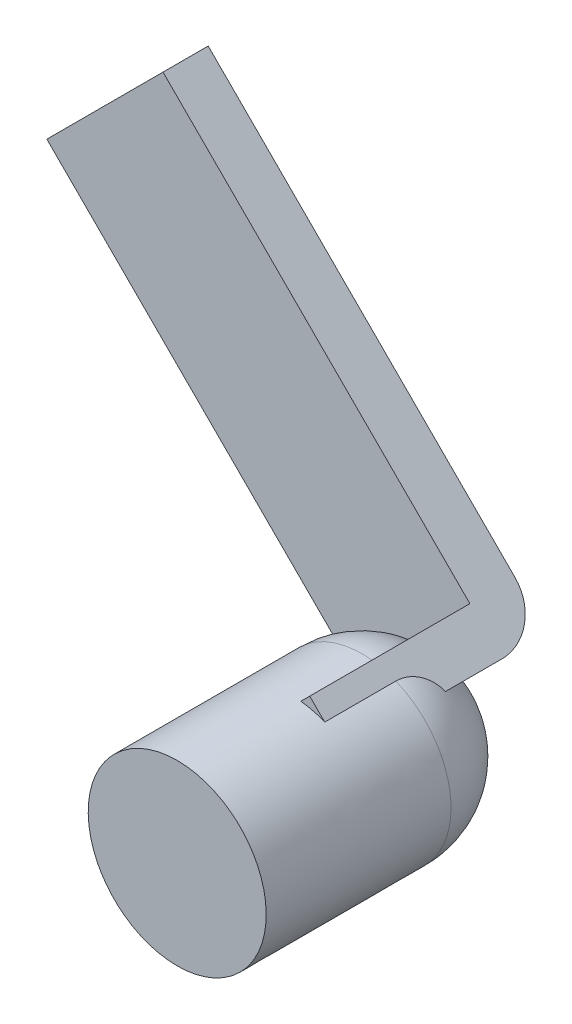
ISO-10303-21;
HEADER;
FILE_DESCRIPTION(('STEP AP214'),'2;1');
FILE_NAME('part.step','',(''),(''),'','','');
FILE_SCHEMA(('AUTOMOTIVE_DESIGN { 1 0 10303 214 1 1 1 1 }'));
ENDSEC;
DATA;
#1=APPLICATION_CONTEXT('core data for automotive mechanical design processes');
#2=APPLICATION_PROTOCOL_DEFINITION('international standard','automotive_design',2000,#1);
#3=PRODUCT_CONTEXT('',#1,'mechanical');
#4=PRODUCT('Part','Part','',(#3));
#5=PRODUCT_RELATED_PRODUCT_CATEGORY('part','',(#4));
#6=PRODUCT_DEFINITION_FORMATION('','',#4);
#7=PRODUCT_DEFINITION_CONTEXT('part definition',#1,'design');
#8=PRODUCT_DEFINITION('design','',#6,#7);
#9=PRODUCT_DEFINITION_SHAPE('','',#8);
#10=(LENGTH_UNIT() NAMED_UNIT(*) SI_UNIT(.MILLI.,.METRE.));
#11=(NAMED_UNIT(*) PLANE_ANGLE_UNIT() SI_UNIT($,.RADIAN.));
#12=(NAMED_UNIT(*) SI_UNIT($,.STERADIAN.) SOLID_ANGLE_UNIT());
#13=UNCERTAINTY_MEASURE_WITH_UNIT(LENGTH_MEASURE(1.E-05),#10,'distance_accuracy_value','');
#14=(GEOMETRIC_REPRESENTATION_CONTEXT(3) GLOBAL_UNCERTAINTY_ASSIGNED_CONTEXT((#13)) GLOBAL_UNIT_ASSIGNED_CONTEXT((#10,
#11,#12)) REPRESENTATION_CONTEXT('',''));
#15=CARTESIAN_POINT('',(0.,0.,0.));
#16=DIRECTION('',(0.,0.,1.));
#17=DIRECTION('',(1.,0.,0.));
#18=AXIS2_PLACEMENT_3D('',#15,#16,#17);
#19=CARTESIAN_POINT('',(-26.8971081368126,-9.39824412995313,2.05031608543586));
#20=CARTESIAN_POINT('',(-26.6637628990209,-9.63158936774474,2.05031608543583));
#21=CARTESIAN_POINT('',(-26.6637628888211,-9.63158935754487,2.38031608543586));
#22=CARTESIAN_POINT('',(-26.0485799993887,-8.54971599252923,2.05031603298217));
#23=CARTESIAN_POINT('',(-25.815234761597,-8.78306123032084,2.05031603298214));
#24=CARTESIAN_POINT('',(-25.8152347513972,-8.78306122012097,2.38031603298216));
#25=(BOUNDED_SURFACE() B_SPLINE_SURFACE(1,2,((#19,#20,#21),(#22,#23,#24)),.UNSPECIFIED.,.F.,.F.,
.F.) B_SPLINE_SURFACE_WITH_KNOTS((2,2),(3,3),(-1.81818181818181,1.818181818182),
(-0.785398163397602,0.78539816339745),
.UNSPECIFIED.) GEOMETRIC_REPRESENTATION_ITEM() RATIONAL_B_SPLINE_SURFACE(((1.,0.707106781186493,
1.),(1.,0.707106781186493,1.))) REPRESENTATION_ITEM('') SURFACE());
#26=CARTESIAN_POINT('',(-26.6637628888211,-9.63158935754484,2.38031608543585));
#27=CARTESIAN_POINT('',(-26.663762899021,-9.63158936774469,2.05031608543588));
#28=CARTESIAN_POINT('',(-26.8971081368125,-9.39824412995315,2.05031608543585));
#29=(BOUNDED_CURVE() B_SPLINE_CURVE(2,(#26,#27,#28),.UNSPECIFIED.,.F.,
.F.) B_SPLINE_CURVE_WITH_KNOTS((3,3),(-0.785398163397449,0.78539816339735),
.UNSPECIFIED.) CURVE() GEOMETRIC_REPRESENTATION_ITEM() RATIONAL_B_SPLINE_CURVE((1.,
0.70710678118657,1.)) REPRESENTATION_ITEM(''));
#30=CARTESIAN_POINT('',(-26.6637628888211,-9.63158935754484,2.38031608543585));
#31=VERTEX_POINT('',#30);
#32=CARTESIAN_POINT('',(-26.8971081368125,-9.39824412995313,2.05031608543585));
#33=VERTEX_POINT('',#32);
#34=EDGE_CURVE('E125',#31,#33,#29,.T.);
#35=CARTESIAN_POINT('',(-26.8971081368125,-9.39824412995312,2.05031608543586));
#36=CARTESIAN_POINT('',(-26.0485799993887,-8.54971599252929,2.05031603298216));
#37=(BOUNDED_CURVE() B_SPLINE_CURVE(1,(#35,#36),.UNSPECIFIED.,.F.,
.F.) B_SPLINE_CURVE_WITH_KNOTS((2,2),(-0.000599999999999982,0.000599999999999982),
.UNSPECIFIED.) CURVE() GEOMETRIC_REPRESENTATION_ITEM() RATIONAL_B_SPLINE_CURVE((1.,1.)) REPRESENTATION_ITEM(''));
#38=CARTESIAN_POINT('',(-26.0485799993887,-8.54971599252927,2.05031603298216));
#39=VERTEX_POINT('',#38);
#40=EDGE_CURVE('E255',#33,#39,#37,.T.);
#41=CARTESIAN_POINT('',(-26.0485799993887,-8.54971599252925,2.05031603298216));
#42=CARTESIAN_POINT('',(-25.8152347615971,-8.78306123032084,2.05031603298212));
#43=CARTESIAN_POINT('',(-25.8152347513972,-8.78306122012099,2.38031603298216));
#44=(BOUNDED_CURVE() B_SPLINE_CURVE(2,(#41,#42,#43),.UNSPECIFIED.,.F.,
.F.) B_SPLINE_CURVE_WITH_KNOTS((3,3),(-0.785398163397578,0.785398163397449),
.UNSPECIFIED.) CURVE() GEOMETRIC_REPRESENTATION_ITEM() RATIONAL_B_SPLINE_CURVE((1.,
0.707106781186495,1.)) REPRESENTATION_ITEM(''));
#45=CARTESIAN_POINT('',(-25.8152347513972,-8.78306122012099,2.38031603298216));
#46=VERTEX_POINT('',#45);
#47=EDGE_CURVE('E127',#39,#46,#44,.T.);
#48=CARTESIAN_POINT('',(-25.8152347513972,-8.78306122012096,2.38031603298216));
#49=CARTESIAN_POINT('',(-26.6637628888211,-9.63158935754483,2.38031608543586));
#50=(BOUNDED_CURVE() B_SPLINE_CURVE(1,(#48,#49),.UNSPECIFIED.,.F.,
.F.) B_SPLINE_CURVE_WITH_KNOTS((2,2),(-0.000600000000000051,0.000599999999999974),
.UNSPECIFIED.) CURVE() GEOMETRIC_REPRESENTATION_ITEM() RATIONAL_B_SPLINE_CURVE((1.,1.)) REPRESENTATION_ITEM(''));
#51=EDGE_CURVE('E11',#46,#31,#50,.T.);
#52=ORIENTED_EDGE('',*,*,#34,.T.);
#53=ORIENTED_EDGE('',*,*,#40,.T.);
#54=ORIENTED_EDGE('',*,*,#47,.T.);
#55=ORIENTED_EDGE('',*,*,#51,.T.);
#56=EDGE_LOOP('',(#52,#53,#54,#55));
#57=FACE_BOUND('',#56,.T.);
#58=ADVANCED_FACE('F17',(#57),#25,.T.);
#59=CARTESIAN_POINT('',(-25.7303819389268,-8.69820840765052,2.33916450777218));
#60=CARTESIAN_POINT('',(-26.7486157038354,-9.7164421725592,2.33916457071661));
#61=CARTESIAN_POINT('',(-25.7303819236635,-8.69820839238727,2.83298274734748));
#62=CARTESIAN_POINT('',(-26.7486156885722,-9.71644215729596,2.83298281029191));
#63=(BOUNDED_SURFACE() B_SPLINE_SURFACE(1,1,((#59,#60),(#61,#62)),.UNSPECIFIED.,.F.,.F.,
.F.) B_SPLINE_SURFACE_WITH_KNOTS((2,2),(2,2),(0.000288848480035386,0.000782666719610689),
(-0.000720000000000017,0.00072000000000006),
.UNSPECIFIED.) GEOMETRIC_REPRESENTATION_ITEM() RATIONAL_B_SPLINE_SURFACE(((1.,1.),(1.,1.))) REPRESENTATION_ITEM('') SURFACE());
#64=CARTESIAN_POINT('',(-25.8152347386779,-8.78306120740161,2.79183123262816));
#65=CARTESIAN_POINT('',(-25.8152347513973,-8.78306122012098,2.38031603298216));
#66=(BOUNDED_CURVE() B_SPLINE_CURVE(1,(#64,#65),.UNSPECIFIED.,.F.,
.F.) B_SPLINE_CURVE_WITH_KNOTS((2,2),(-0.00074151519964601,-0.00033000000000001),
.UNSPECIFIED.) CURVE() GEOMETRIC_REPRESENTATION_ITEM() RATIONAL_B_SPLINE_CURVE((1.,1.)) REPRESENTATION_ITEM(''));
#67=CARTESIAN_POINT('',(-25.8152347386778,-8.78306120740161,2.79183123262816));
#68=VERTEX_POINT('',#67);
#69=EDGE_CURVE('E32',#68,#46,#66,.T.);
#70=CARTESIAN_POINT('',(-26.6637628761017,-9.63158934482535,2.79183128508192));
#71=CARTESIAN_POINT('',(-26.54932383486,-9.51715030358372,2.38465749985454));
#72=CARTESIAN_POINT('',(-26.239498819975,-9.20732528869871,2.38465748070201));
#73=CARTESIAN_POINT('',(-25.92967380509,-8.89750027381369,2.38465746154948));
#74=CARTESIAN_POINT('',(-25.815234738678,-8.7830612074017,2.79183123262824));
#75=(BOUNDED_CURVE() B_SPLINE_CURVE(2,(#70,#71,#72,#73,#74),.UNSPECIFIED.,.F.,
.F.) B_SPLINE_CURVE_WITH_KNOTS((3,2,3),(0.378327472171939,1.57079632679491,2.76326518141788),
.UNSPECIFIED.) CURVE() GEOMETRIC_REPRESENTATION_ITEM() RATIONAL_B_SPLINE_CURVE((1.,
0.827455960729688,1.,0.827455960729714,1.)) REPRESENTATION_ITEM(''));
#76=CARTESIAN_POINT('',(-26.6637628761018,-9.63158934482547,2.79183128508185));
#77=VERTEX_POINT('',#76);
#78=EDGE_CURVE('E130',#77,#68,#75,.T.);
#79=CARTESIAN_POINT('',(-26.6637628888212,-9.63158935754484,2.38031608543585));
#80=CARTESIAN_POINT('',(-26.6637628761018,-9.63158934482547,2.79183128508185));
#81=(BOUNDED_CURVE() B_SPLINE_CURVE(1,(#79,#80),.UNSPECIFIED.,.F.,
.F.) B_SPLINE_CURVE_WITH_KNOTS((2,2),(0.00033,0.000741515199646),
.UNSPECIFIED.) CURVE() GEOMETRIC_REPRESENTATION_ITEM() RATIONAL_B_SPLINE_CURVE((1.,1.)) REPRESENTATION_ITEM(''));
#82=EDGE_CURVE('E120',#31,#77,#81,.T.);
#83=ORIENTED_EDGE('',*,*,#51,.F.);
#84=ORIENTED_EDGE('',*,*,#69,.F.);
#85=ORIENTED_EDGE('',*,*,#78,.F.);
#86=ORIENTED_EDGE('',*,*,#82,.F.);
#87=EDGE_LOOP('',(#83,#84,#85,#86));
#88=FACE_BOUND('',#87,.T.);
#89=ADVANCED_FACE('F131',(#88),#63,.T.);
#90=CARTESIAN_POINT('',(-25.5677473928181,-9.03054860837243,1.90031603298211));
#91=CARTESIAN_POINT('',(-25.5677473371825,-9.03054855273689,3.70031603298215));
#92=CARTESIAN_POINT('',(-28.5375958738016,-6.06070012738889,1.90031603298212));
#93=CARTESIAN_POINT('',(-28.5375958181661,-6.06070007175335,3.70031603298216));
#94=(BOUNDED_SURFACE() B_SPLINE_SURFACE(1,1,((#90,#91),(#92,#93)),.UNSPECIFIED.,.F.,.F.,
.F.) B_SPLINE_SURFACE_WITH_KNOTS((2,2),(2,2),(-0.00172911,0.00247089000000004),
(-0.000529110000000045,0.00127089),
.UNSPECIFIED.) GEOMETRIC_REPRESENTATION_ITEM() RATIONAL_B_SPLINE_SURFACE(((1.,1.),(1.,1.))) REPRESENTATION_ITEM('') SURFACE());
#95=CARTESIAN_POINT('',(-26.0485799993887,-8.54971599252925,2.05031603298216));
#96=CARTESIAN_POINT('',(-28.29010849575,-6.30818749616792,2.05031603298216));
#97=(BOUNDED_CURVE() B_SPLINE_CURVE(1,(#95,#96),.UNSPECIFIED.,.F.,
.F.) B_SPLINE_CURVE_WITH_KNOTS((2,2),(-0.00316999999999996,0.),
.UNSPECIFIED.) CURVE() GEOMETRIC_REPRESENTATION_ITEM() RATIONAL_B_SPLINE_CURVE((1.,1.)) REPRESENTATION_ITEM(''));
#98=CARTESIAN_POINT('',(-28.29010849575,-6.30818749616792,2.05031603298216));
#99=VERTEX_POINT('',#98);
#100=EDGE_CURVE('E276',#39,#99,#97,.T.);
#101=CARTESIAN_POINT('',(-28.29010849575,-6.30818749616791,2.05031603298216));
#102=CARTESIAN_POINT('',(-28.2901084855502,-6.30818748596806,2.38031603298216));
#103=(BOUNDED_CURVE() B_SPLINE_CURVE(1,(#101,#102),.UNSPECIFIED.,.F.,
.F.) B_SPLINE_CURVE_WITH_KNOTS((2,2),(-0.00033,0.),
.UNSPECIFIED.) CURVE() GEOMETRIC_REPRESENTATION_ITEM() RATIONAL_B_SPLINE_CURVE((1.,1.)) REPRESENTATION_ITEM(''));
#104=CARTESIAN_POINT('',(-28.2901084855502,-6.30818748596806,2.38031603298216));
#105=VERTEX_POINT('',#104);
#106=EDGE_CURVE('E237',#99,#105,#103,.T.);
#107=CARTESIAN_POINT('',(-28.2901084855502,-6.30818748596805,2.38031603298216));
#108=CARTESIAN_POINT('',(-26.0485799891888,-8.54971598232943,2.38031603298216));
#109=(BOUNDED_CURVE() B_SPLINE_CURVE(1,(#107,#108),.UNSPECIFIED.,.F.,
.F.) B_SPLINE_CURVE_WITH_KNOTS((2,2),(-0.00317000000000004,0.),
.UNSPECIFIED.) CURVE() GEOMETRIC_REPRESENTATION_ITEM() RATIONAL_B_SPLINE_CURVE((1.,1.)) REPRESENTATION_ITEM(''));
#110=CARTESIAN_POINT('',(-26.0485799891888,-8.54971598232943,2.38031603298216));
#111=VERTEX_POINT('',#110);
#112=EDGE_CURVE('E238',#105,#111,#109,.T.);
#113=CARTESIAN_POINT('',(-26.0485799891888,-8.54971598232943,2.38031603298216));
#114=CARTESIAN_POINT('',(-26.0485799530257,-8.54971594616633,3.55031603298215));
#115=(BOUNDED_CURVE() B_SPLINE_CURVE(1,(#113,#114),.UNSPECIFIED.,.F.,
.F.) B_SPLINE_CURVE_WITH_KNOTS((2,2),(-0.00117,0.),
.UNSPECIFIED.) CURVE() GEOMETRIC_REPRESENTATION_ITEM() RATIONAL_B_SPLINE_CURVE((1.,1.)) REPRESENTATION_ITEM(''));
#116=CARTESIAN_POINT('',(-26.0485799530257,-8.54971594616633,3.55031603298215));
#117=VERTEX_POINT('',#116);
#118=EDGE_CURVE('E161',#111,#117,#115,.T.);
#119=CARTESIAN_POINT('',(-26.0485799530257,-8.54971594616631,3.55031603298215));
#120=CARTESIAN_POINT('',(-25.9389784019418,-8.65931749725021,3.55031603298215));
#121=(BOUNDED_CURVE() B_SPLINE_CURVE(1,(#119,#120),.UNSPECIFIED.,.F.,
.F.) B_SPLINE_CURVE_WITH_KNOTS((2,2),(-0.000330000000000026,-0.000175000000000043),
.UNSPECIFIED.) CURVE() GEOMETRIC_REPRESENTATION_ITEM() RATIONAL_B_SPLINE_CURVE((1.,1.)) REPRESENTATION_ITEM(''));
#122=CARTESIAN_POINT('',(-25.9389784019418,-8.65931749725024,3.55031603298215));
#123=VERTEX_POINT('',#122);
#124=EDGE_CURVE('E162',#117,#123,#121,.T.);
#125=CARTESIAN_POINT('',(-25.9389784180142,-8.65931751332272,3.03031603298215));
#126=CARTESIAN_POINT('',(-25.9389784019417,-8.65931749725023,3.55031603298215));
#127=(BOUNDED_CURVE() B_SPLINE_CURVE(1,(#125,#126),.UNSPECIFIED.,.F.,
.F.) B_SPLINE_CURVE_WITH_KNOTS((2,2),(-0.000675,-0.000155),
.UNSPECIFIED.) CURVE() GEOMETRIC_REPRESENTATION_ITEM() RATIONAL_B_SPLINE_CURVE((1.,1.)) REPRESENTATION_ITEM(''));
#128=CARTESIAN_POINT('',(-25.9389784180143,-8.65931751332273,3.03031603298215));
#129=VERTEX_POINT('',#128);
#130=EDGE_CURVE('E219',#129,#123,#127,.T.);
#131=CARTESIAN_POINT('',(-25.8152347386779,-8.78306120740162,2.79183123262791));
#132=CARTESIAN_POINT('',(-25.9389784236845,-8.65931751899291,2.8468661865558));
#133=CARTESIAN_POINT('',(-25.9389784180143,-8.65931751332272,3.03031603298215));
#134=(BOUNDED_CURVE() B_SPLINE_CURVE(2,(#131,#132,#133),.UNSPECIFIED.,.F.,
.F.) B_SPLINE_CURVE_WITH_KNOTS((3,3),(0.304692654015335,1.5707963267949),
.UNSPECIFIED.) CURVE() GEOMETRIC_REPRESENTATION_ITEM() RATIONAL_B_SPLINE_CURVE((1.,
0.806225774829823,1.)) REPRESENTATION_ITEM(''));
#135=EDGE_CURVE('E134',#68,#129,#134,.T.);
#136=ORIENTED_EDGE('',*,*,#47,.F.);
#137=ORIENTED_EDGE('',*,*,#100,.T.);
#138=ORIENTED_EDGE('',*,*,#106,.T.);
#139=ORIENTED_EDGE('',*,*,#112,.T.);
#140=ORIENTED_EDGE('',*,*,#118,.T.);
#141=ORIENTED_EDGE('',*,*,#124,.T.);
#142=ORIENTED_EDGE('',*,*,#130,.F.);
#143=ORIENTED_EDGE('',*,*,#135,.F.);
#144=ORIENTED_EDGE('',*,*,#69,.T.);
#145=EDGE_LOOP('',(#136,#137,#138,#139,#140,#141,#142,#143,#144));
#146=FACE_BOUND('',#145,.T.);
#147=ADVANCED_FACE('F475',(#146),#94,.T.);
#148=CARTESIAN_POINT('',(-29.3861240112255,-6.90922826481281,1.90031608543585));
#149=CARTESIAN_POINT('',(-29.3861239555899,-6.90922820917727,3.70031608543586));
#150=CARTESIAN_POINT('',(-26.416275530242,-9.87907674579628,1.90031608543584));
#151=CARTESIAN_POINT('',(-26.4162754746065,-9.87907669016074,3.70031608543585));
#152=(BOUNDED_SURFACE() B_SPLINE_SURFACE(1,1,((#148,#149),(#150,#151)),.UNSPECIFIED.,.F.,.F.,
.F.) B_SPLINE_SURFACE_WITH_KNOTS((2,2),(2,2),(-0.00247088999999996,0.00172911),(-0.00052911,
0.00127089),.UNSPECIFIED.) GEOMETRIC_REPRESENTATION_ITEM() RATIONAL_B_SPLINE_SURFACE(((1.,1.),
(1.,1.))) REPRESENTATION_ITEM('') SURFACE());
#153=CARTESIAN_POINT('',(-26.7875065554381,-9.50784565074659,3.03031608543585));
#154=CARTESIAN_POINT('',(-26.7875065611083,-9.50784565641678,2.84686623900961));
#155=CARTESIAN_POINT('',(-26.6637628761018,-9.63158934482539,2.79183128508165));
#156=(BOUNDED_CURVE() B_SPLINE_CURVE(2,(#153,#154,#155),.UNSPECIFIED.,.F.,
.F.) B_SPLINE_CURVE_WITH_KNOTS((3,3),(1.5707963267949,2.83689999957391),
.UNSPECIFIED.) CURVE() GEOMETRIC_REPRESENTATION_ITEM() RATIONAL_B_SPLINE_CURVE((1.,
0.806225774830023,1.)) REPRESENTATION_ITEM(''));
#157=CARTESIAN_POINT('',(-26.7875065554381,-9.50784565074658,3.03031608543585));
#158=VERTEX_POINT('',#157);
#159=EDGE_CURVE('E81',#158,#77,#156,.T.);
#160=CARTESIAN_POINT('',(-26.7875065393656,-9.5078456346741,3.55031608543585));
#161=CARTESIAN_POINT('',(-26.7875065554381,-9.50784565074659,3.03031608543585));
#162=(BOUNDED_CURVE() B_SPLINE_CURVE(1,(#160,#161),.UNSPECIFIED.,.F.,
.F.) B_SPLINE_CURVE_WITH_KNOTS((2,2),(0.000155,0.000675),
.UNSPECIFIED.) CURVE() GEOMETRIC_REPRESENTATION_ITEM() RATIONAL_B_SPLINE_CURVE((1.,1.)) REPRESENTATION_ITEM(''));
#163=CARTESIAN_POINT('',(-26.7875065393656,-9.50784563467409,3.55031608543585));
#164=VERTEX_POINT('',#163);
#165=EDGE_CURVE('E190',#164,#158,#162,.T.);
#166=CARTESIAN_POINT('',(-26.7875065393656,-9.50784563467412,3.55031608543585));
#167=CARTESIAN_POINT('',(-26.8971080904496,-9.39824408359016,3.55031608543585));
#168=(BOUNDED_CURVE() B_SPLINE_CURVE(1,(#166,#167),.UNSPECIFIED.,.F.,
.F.) B_SPLINE_CURVE_WITH_KNOTS((2,2),(0.000174999999999971,0.000330000000000026),
.UNSPECIFIED.) CURVE() GEOMETRIC_REPRESENTATION_ITEM() RATIONAL_B_SPLINE_CURVE((1.,1.)) REPRESENTATION_ITEM(''));
#169=CARTESIAN_POINT('',(-26.8971080904496,-9.39824408359018,3.55031608543585));
#170=VERTEX_POINT('',#169);
#171=EDGE_CURVE('E284',#164,#170,#168,.T.);
#172=CARTESIAN_POINT('',(-26.8971080904496,-9.39824408359018,3.55031608543585));
#173=CARTESIAN_POINT('',(-26.8971081266127,-9.39824411975328,2.38031608543585));
#174=(BOUNDED_CURVE() B_SPLINE_CURVE(1,(#172,#173),.UNSPECIFIED.,.F.,
.F.) B_SPLINE_CURVE_WITH_KNOTS((2,2),(0.,0.00117),
.UNSPECIFIED.) CURVE() GEOMETRIC_REPRESENTATION_ITEM() RATIONAL_B_SPLINE_CURVE((1.,1.)) REPRESENTATION_ITEM(''));
#175=CARTESIAN_POINT('',(-26.8971081266127,-9.39824411975328,2.38031608543585));
#176=VERTEX_POINT('',#175);
#177=EDGE_CURVE('E170',#170,#176,#174,.T.);
#178=CARTESIAN_POINT('',(-26.8971081266127,-9.39824411975328,2.38031608543585));
#179=CARTESIAN_POINT('',(-29.138636622974,-7.15671562339196,2.38031608543585));
#180=(BOUNDED_CURVE() B_SPLINE_CURVE(1,(#178,#179),.UNSPECIFIED.,.F.,
.F.) B_SPLINE_CURVE_WITH_KNOTS((2,2),(0.,0.00316999999999995),
.UNSPECIFIED.) CURVE() GEOMETRIC_REPRESENTATION_ITEM() RATIONAL_B_SPLINE_CURVE((1.,1.)) REPRESENTATION_ITEM(''));
#181=CARTESIAN_POINT('',(-29.138636622974,-7.15671562339193,2.38031608543585));
#182=VERTEX_POINT('',#181);
#183=EDGE_CURVE('E208',#176,#182,#180,.T.);
#184=CARTESIAN_POINT('',(-29.138636622974,-7.15671562339193,2.38031608543585));
#185=CARTESIAN_POINT('',(-29.1386366331739,-7.15671563359178,2.05031608543585));
#186=(BOUNDED_CURVE() B_SPLINE_CURVE(1,(#184,#185),.UNSPECIFIED.,.F.,
.F.) B_SPLINE_CURVE_WITH_KNOTS((2,2),(0.,0.00033),
.UNSPECIFIED.) CURVE() GEOMETRIC_REPRESENTATION_ITEM() RATIONAL_B_SPLINE_CURVE((1.,1.)) REPRESENTATION_ITEM(''));
#187=CARTESIAN_POINT('',(-29.1386366331738,-7.15671563359177,2.05031608543585));
#188=VERTEX_POINT('',#187);
#189=EDGE_CURVE('E229',#182,#188,#186,.T.);
#190=CARTESIAN_POINT('',(-29.1386366331738,-7.15671563359177,2.05031608543585));
#191=CARTESIAN_POINT('',(-26.8971081368125,-9.3982441299531,2.05031608543585));
#192=(BOUNDED_CURVE() B_SPLINE_CURVE(1,(#190,#191),.UNSPECIFIED.,.F.,
.F.) B_SPLINE_CURVE_WITH_KNOTS((2,2),(0.,0.00316999999999996),
.UNSPECIFIED.) CURVE() GEOMETRIC_REPRESENTATION_ITEM() RATIONAL_B_SPLINE_CURVE((1.,1.)) REPRESENTATION_ITEM(''));
#193=EDGE_CURVE('E378',#188,#33,#192,.T.);
#194=ORIENTED_EDGE('',*,*,#34,.F.);
#195=ORIENTED_EDGE('',*,*,#82,.T.);
#196=ORIENTED_EDGE('',*,*,#159,.F.);
#197=ORIENTED_EDGE('',*,*,#165,.F.);
#198=ORIENTED_EDGE('',*,*,#171,.T.);
#199=ORIENTED_EDGE('',*,*,#177,.T.);
#200=ORIENTED_EDGE('',*,*,#183,.T.);
#201=ORIENTED_EDGE('',*,*,#189,.T.);
#202=ORIENTED_EDGE('',*,*,#193,.T.);
#203=EDGE_LOOP('',(#194,#195,#196,#197,#198,#199,#200,#201,#202));
#204=FACE_BOUND('',#203,.T.);
#205=ADVANCED_FACE('F122',(#204),#152,.T.);
#206=CARTESIAN_POINT('',(-25.963727135667,-8.46486312880763,3.6673160277368));
#207=CARTESIAN_POINT('',(-26.9819609005756,-9.48309689371629,3.66731609068123));
#208=CARTESIAN_POINT('',(-25.9637271790627,-8.46486317220336,2.26331602773679));
#209=CARTESIAN_POINT('',(-26.9819609439714,-9.48309693711201,2.26331609068122));
#210=(BOUNDED_SURFACE() B_SPLINE_SURFACE(1,1,((#206,#207),(#208,#209)),.UNSPECIFIED.,.F.,.F.,
.F.) B_SPLINE_SURFACE_WITH_KNOTS((2,2),(2,2),(-0.000117,0.001287),(-0.000719999999999974,
0.000720000000000066),
.UNSPECIFIED.) GEOMETRIC_REPRESENTATION_ITEM() RATIONAL_B_SPLINE_SURFACE(((1.,1.),(1.,1.))) REPRESENTATION_ITEM('') SURFACE());
#211=CARTESIAN_POINT('',(-26.8323402130334,-9.33347620617401,3.03031608143207));
#212=CARTESIAN_POINT('',(-26.8323401969609,-9.33347619010152,3.55031608143208));
#213=(BOUNDED_CURVE() B_SPLINE_CURVE(1,(#211,#212),.UNSPECIFIED.,.F.,
.F.) B_SPLINE_CURVE_WITH_KNOTS((2,2),(-0.000675,-0.00015499999999999),
.UNSPECIFIED.) CURVE() GEOMETRIC_REPRESENTATION_ITEM() RATIONAL_B_SPLINE_CURVE((1.,1.)) REPRESENTATION_ITEM(''));
#214=CARTESIAN_POINT('',(-26.8323402130334,-9.333476206174,3.03031608143207));
#215=VERTEX_POINT('',#214);
#216=CARTESIAN_POINT('',(-26.8323401969609,-9.33347619010151,3.55031608143208));
#217=VERTEX_POINT('',#216);
#218=EDGE_CURVE('E198',#215,#217,#213,.T.);
#219=CARTESIAN_POINT('',(-26.1133478625868,-8.61448385572746,3.03031603698593));
#220=CARTESIAN_POINT('',(-26.1133478783009,-8.61448387144155,2.52191167036394));
#221=CARTESIAN_POINT('',(-26.4728440535242,-8.97398004666481,2.52191169258701));
#222=CARTESIAN_POINT('',(-26.8323402287474,-9.33347622188807,2.52191171481008));
#223=CARTESIAN_POINT('',(-26.8323402130334,-9.333476206174,3.03031608143207));
#224=(BOUNDED_CURVE() B_SPLINE_CURVE(2,(#219,#220,#221,#222,#223),.UNSPECIFIED.,.F.,
.F.) B_SPLINE_CURVE_WITH_KNOTS((3,2,3),(0.,1.57079632679489,3.14159265358977),
.UNSPECIFIED.) CURVE() GEOMETRIC_REPRESENTATION_ITEM() RATIONAL_B_SPLINE_CURVE((1.,
0.707106781186546,1.,0.707106781186556,1.)) REPRESENTATION_ITEM(''));
#225=CARTESIAN_POINT('',(-26.1133478625868,-8.61448385572747,3.03031603698593));
#226=VERTEX_POINT('',#225);
#227=EDGE_CURVE('E247',#226,#215,#224,.T.);
#228=CARTESIAN_POINT('',(-26.1133478465143,-8.61448383965498,3.55031603698593));
#229=CARTESIAN_POINT('',(-26.1133478625868,-8.61448385572747,3.03031603698593));
#230=(BOUNDED_CURVE() B_SPLINE_CURVE(1,(#228,#229),.UNSPECIFIED.,.F.,
.F.) B_SPLINE_CURVE_WITH_KNOTS((2,2),(0.000155,0.000675),
.UNSPECIFIED.) CURVE() GEOMETRIC_REPRESENTATION_ITEM() RATIONAL_B_SPLINE_CURVE((1.,1.)) REPRESENTATION_ITEM(''));
#231=CARTESIAN_POINT('',(-26.1133478465144,-8.61448383965498,3.55031603698593));
#232=VERTEX_POINT('',#231);
#233=EDGE_CURVE('E181',#232,#226,#230,.T.);
#234=CARTESIAN_POINT('',(-26.0485799530257,-8.54971594616633,3.55031603298216));
#235=CARTESIAN_POINT('',(-26.1133478465144,-8.61448383965501,3.55031603698594));
#236=(BOUNDED_CURVE() B_SPLINE_CURVE(1,(#234,#235),.UNSPECIFIED.,.F.,
.F.) B_SPLINE_CURVE_WITH_KNOTS((2,2),(-0.000599999999999969,-0.000508404366621946),
.UNSPECIFIED.) CURVE() GEOMETRIC_REPRESENTATION_ITEM() RATIONAL_B_SPLINE_CURVE((1.,1.)) REPRESENTATION_ITEM(''));
#237=EDGE_CURVE('E153',#117,#232,#236,.T.);
#238=CARTESIAN_POINT('',(-26.0485799891888,-8.54971598232943,2.38031603298216));
#239=CARTESIAN_POINT('',(-26.8971081266127,-9.39824411975331,2.38031608543586));
#240=(BOUNDED_CURVE() B_SPLINE_CURVE(1,(#238,#239),.UNSPECIFIED.,.F.,
.F.) B_SPLINE_CURVE_WITH_KNOTS((2,2),(-0.000599999999999966,0.00060000000000006),
.UNSPECIFIED.) CURVE() GEOMETRIC_REPRESENTATION_ITEM() RATIONAL_B_SPLINE_CURVE((1.,1.)) REPRESENTATION_ITEM(''));
#241=EDGE_CURVE('E217',#111,#176,#240,.T.);
#242=CARTESIAN_POINT('',(-26.8323401969609,-9.33347619010152,3.55031608143208));
#243=CARTESIAN_POINT('',(-26.8971080904496,-9.39824408359021,3.55031608543586));
#244=(BOUNDED_CURVE() B_SPLINE_CURVE(1,(#242,#243),.UNSPECIFIED.,.F.,
.F.) B_SPLINE_CURVE_WITH_KNOTS((2,2),(0.000508404366622022,0.000600000000000057),
.UNSPECIFIED.) CURVE() GEOMETRIC_REPRESENTATION_ITEM() RATIONAL_B_SPLINE_CURVE((1.,1.)) REPRESENTATION_ITEM(''));
#245=EDGE_CURVE('E362',#217,#170,#244,.T.);
#246=ORIENTED_EDGE('',*,*,#218,.F.);
#247=ORIENTED_EDGE('',*,*,#227,.F.);
#248=ORIENTED_EDGE('',*,*,#233,.F.);
#249=ORIENTED_EDGE('',*,*,#237,.F.);
#250=ORIENTED_EDGE('',*,*,#118,.F.);
#251=ORIENTED_EDGE('',*,*,#241,.T.);
#252=ORIENTED_EDGE('',*,*,#177,.F.);
#253=ORIENTED_EDGE('',*,*,#245,.F.);
#254=EDGE_LOOP('',(#246,#247,#248,#249,#250,#251,#252,#253));
#255=FACE_BOUND('',#254,.T.);
#256=ADVANCED_FACE('F396',(#255),#210,.T.);
#257=CARTESIAN_POINT('',(-25.9215414574845,-8.66380086300972,3.55031603258178));
#258=CARTESIAN_POINT('',(-25.9992629296711,-8.74152233519632,3.55031603738631));
#259=CARTESIAN_POINT('',(-26.0530633187852,-8.53227900170904,3.55031603258178));
#260=CARTESIAN_POINT('',(-26.1307847909718,-8.61000047389563,3.55031603738631));
#261=(BOUNDED_SURFACE() B_SPLINE_SURFACE(1,1,((#257,#258),(#259,#260)),.UNSPECIFIED.,.F.,.F.,
.F.) B_SPLINE_SURFACE_WITH_KNOTS((2,2),(2,2),(0.000159499999999977,0.00034549999999996),
(-0.000609159563337864,-0.000499244803283975),
.UNSPECIFIED.) GEOMETRIC_REPRESENTATION_ITEM() RATIONAL_B_SPLINE_SURFACE(((1.,1.),(1.,1.))) REPRESENTATION_ITEM('') SURFACE());
#262=CARTESIAN_POINT('',(-25.9389784019418,-8.65931749725024,3.55031603298215));
#263=CARTESIAN_POINT('',(-26.0230283400571,-8.62470869920278,3.55031603451031));
#264=CARTESIAN_POINT('',(-26.1133478465144,-8.61448383965522,3.55031603698593));
#265=(BOUNDED_CURVE() B_SPLINE_CURVE(2,(#262,#263,#264),.UNSPECIFIED.,.F.,
.F.) B_SPLINE_CURVE_WITH_KNOTS((3,3),(1.96558744649465,2.2434667719093),
.UNSPECIFIED.) CURVE() GEOMETRIC_REPRESENTATION_ITEM() RATIONAL_B_SPLINE_CURVE((1.,
0.990363402296039,1.)) REPRESENTATION_ITEM(''));
#266=EDGE_CURVE('E228',#123,#232,#265,.T.);
#267=ORIENTED_EDGE('',*,*,#266,.F.);
#268=ORIENTED_EDGE('',*,*,#124,.F.);
#269=ORIENTED_EDGE('',*,*,#237,.T.);
#270=EDGE_LOOP('',(#267,#268,#269));
#271=FACE_BOUND('',#270,.T.);
#272=ADVANCED_FACE('F511',(#271),#261,.T.);
#273=CARTESIAN_POINT('',(-26.7053017014196,-9.44756110694484,3.55031608103169));
#274=CARTESIAN_POINT('',(-26.7830231736061,-9.52528257913141,3.55031608583622));
#275=CARTESIAN_POINT('',(-26.8368235627203,-9.31603924564409,3.55031608103169));
#276=CARTESIAN_POINT('',(-26.9145450349069,-9.39376071783067,3.55031608583622));
#277=(BOUNDED_SURFACE() B_SPLINE_SURFACE(1,1,((#273,#274),(#275,#276)),.UNSPECIFIED.,.F.,.F.,
.F.) B_SPLINE_SURFACE_WITH_KNOTS((2,2),(2,2),(0.000159499999999937,0.0003455),
(0.000499244803283984,0.000609159563337842),
.UNSPECIFIED.) GEOMETRIC_REPRESENTATION_ITEM() RATIONAL_B_SPLINE_SURFACE(((1.,1.),(1.,1.))) REPRESENTATION_ITEM('') SURFACE());
#278=CARTESIAN_POINT('',(-26.8323401969607,-9.33347619010148,3.55031608143207));
#279=CARTESIAN_POINT('',(-26.8221153374131,-9.42379569655886,3.55031608390769));
#280=CARTESIAN_POINT('',(-26.7875065393657,-9.50784563467411,3.55031608543585));
#281=(BOUNDED_CURVE() B_SPLINE_CURVE(2,(#278,#279,#280),.UNSPECIFIED.,.F.,
.F.) B_SPLINE_CURVE_WITH_KNOTS((3,3),(-2.24346677190929,-1.96558744649462),
.UNSPECIFIED.) CURVE() GEOMETRIC_REPRESENTATION_ITEM() RATIONAL_B_SPLINE_CURVE((1.,
0.990363402296619,1.)) REPRESENTATION_ITEM(''));
#282=EDGE_CURVE('E23',#217,#164,#281,.T.);
#283=ORIENTED_EDGE('',*,*,#282,.F.);
#284=ORIENTED_EDGE('',*,*,#245,.T.);
#285=ORIENTED_EDGE('',*,*,#171,.F.);
#286=EDGE_LOOP('',(#283,#284,#285));
#287=FACE_BOUND('',#286,.T.);
#288=ADVANCED_FACE('F393',(#287),#277,.T.);
#289=CARTESIAN_POINT('',(-28.2052556707878,-6.22333467120568,2.4133160277368));
#290=CARTESIAN_POINT('',(-29.2234894356964,-7.24156843611432,2.41331609068123));
#291=CARTESIAN_POINT('',(-28.2052556830276,-6.2233346834455,2.01731602773679));
#292=CARTESIAN_POINT('',(-29.2234894479362,-7.24156844835414,2.01731609068122));
#293=(BOUNDED_SURFACE() B_SPLINE_SURFACE(1,1,((#289,#290),(#291,#292)),.UNSPECIFIED.,.F.,.F.,
.F.) B_SPLINE_SURFACE_WITH_KNOTS((2,2),(2,2),(-3.30000000000008E-05,0.000363000000000007),
(-0.000720000000000025,0.000719999999999984),
.UNSPECIFIED.) GEOMETRIC_REPRESENTATION_ITEM() RATIONAL_B_SPLINE_SURFACE(((1.,1.),(1.,1.))) REPRESENTATION_ITEM('') SURFACE());
#294=CARTESIAN_POINT('',(-29.1386366331739,-7.15671563359171,2.05031608543586));
#295=CARTESIAN_POINT('',(-28.29010849575,-6.30818749616788,2.05031603298216));
#296=(BOUNDED_CURVE() B_SPLINE_CURVE(1,(#294,#295),.UNSPECIFIED.,.F.,
.F.) B_SPLINE_CURVE_WITH_KNOTS((2,2),(-0.000599999999999912,0.000600000000000046),
.UNSPECIFIED.) CURVE() GEOMETRIC_REPRESENTATION_ITEM() RATIONAL_B_SPLINE_CURVE((1.,1.)) REPRESENTATION_ITEM(''));
#297=EDGE_CURVE('E312',#188,#99,#296,.T.);
#298=CARTESIAN_POINT('',(-28.2901084855502,-6.30818748596808,2.38031603298216));
#299=CARTESIAN_POINT('',(-29.138636622974,-7.15671562339192,2.38031608543586));
#300=(BOUNDED_CURVE() B_SPLINE_CURVE(1,(#298,#299),.UNSPECIFIED.,.F.,
.F.) B_SPLINE_CURVE_WITH_KNOTS((2,2),(-0.000599999999999991,0.000599999999999981),
.UNSPECIFIED.) CURVE() GEOMETRIC_REPRESENTATION_ITEM() RATIONAL_B_SPLINE_CURVE((1.,1.)) REPRESENTATION_ITEM(''));
#301=EDGE_CURVE('E218',#105,#182,#300,.T.);
#302=ORIENTED_EDGE('',*,*,#297,.F.);
#303=ORIENTED_EDGE('',*,*,#189,.F.);
#304=ORIENTED_EDGE('',*,*,#301,.F.);
#305=ORIENTED_EDGE('',*,*,#106,.F.);
#306=EDGE_LOOP('',(#302,#303,#304,#305));
#307=FACE_BOUND('',#306,.T.);
#308=ADVANCED_FACE('F19',(#307),#293,.T.);
#309=CARTESIAN_POINT('',(-25.7395743258103,-8.68901601822319,2.38031602773679));
#310=CARTESIAN_POINT('',(-26.7578080907189,-9.70724978313184,2.38031609068122));
#311=CARTESIAN_POINT('',(-28.4294085214439,-5.99918182258952,2.3803160277368));
#312=CARTESIAN_POINT('',(-29.4476422863526,-7.01741558749817,2.38031609068123));
#313=(BOUNDED_SURFACE() B_SPLINE_SURFACE(1,1,((#309,#310),(#311,#312)),.UNSPECIFIED.,.F.,.F.,
.F.) B_SPLINE_SURFACE_WITH_KNOTS((2,2),(2,2),(-0.000317000000000007,0.00348700000000006),
(-0.000719999999999972,0.000720000000000064),
.UNSPECIFIED.) GEOMETRIC_REPRESENTATION_ITEM() RATIONAL_B_SPLINE_SURFACE(((1.,1.),(1.,1.))) REPRESENTATION_ITEM('') SURFACE());
#314=ORIENTED_EDGE('',*,*,#301,.T.);
#315=ORIENTED_EDGE('',*,*,#183,.F.);
#316=ORIENTED_EDGE('',*,*,#241,.F.);
#317=ORIENTED_EDGE('',*,*,#112,.F.);
#318=EDGE_LOOP('',(#314,#315,#316,#317));
#319=FACE_BOUND('',#318,.T.);
#320=ADVANCED_FACE('F507',(#319),#313,.T.);
#321=CARTESIAN_POINT('',(-28.4294085316438,-5.99918183278935,2.0503160277368));
#322=CARTESIAN_POINT('',(-29.4476422965524,-7.01741559769798,2.05031609068123));
#323=CARTESIAN_POINT('',(-25.7395743360101,-8.68901602842303,2.05031602773679));
#324=CARTESIAN_POINT('',(-26.7578081009188,-9.70724979333166,2.05031609068122));
#325=(BOUNDED_SURFACE() B_SPLINE_SURFACE(1,1,((#321,#322),(#323,#324)),.UNSPECIFIED.,.F.,.F.,
.F.) B_SPLINE_SURFACE_WITH_KNOTS((2,2),(2,2),(-0.000317000000000007,0.00348700000000006),
(-0.000720000000000049,0.000719999999999955),
.UNSPECIFIED.) GEOMETRIC_REPRESENTATION_ITEM() RATIONAL_B_SPLINE_SURFACE(((1.,1.),(1.,1.))) REPRESENTATION_ITEM('') SURFACE());
#326=ORIENTED_EDGE('',*,*,#40,.F.);
#327=ORIENTED_EDGE('',*,*,#193,.F.);
#328=ORIENTED_EDGE('',*,*,#297,.T.);
#329=ORIENTED_EDGE('',*,*,#100,.F.);
#330=EDGE_LOOP('',(#326,#327,#328,#329));
#331=FACE_BOUND('',#330,.T.);
#332=ADVANCED_FACE('F473',(#331),#325,.T.);
#333=CARTESIAN_POINT('',(-26.1133478625868,-8.61448385572772,3.03031603698593));
#334=CARTESIAN_POINT('',(-26.4245946647031,-8.5792483350623,3.03031604551706));
#335=CARTESIAN_POINT('',(-26.6460851992009,-8.80073886956003,3.030316059209));
#336=CARTESIAN_POINT('',(-26.8675757336986,-9.02222940405772,3.03031607290094));
#337=CARTESIAN_POINT('',(-26.8323402130332,-9.33347620617397,3.03031608143207));
#338=CARTESIAN_POINT('',(-26.1133478726452,-8.6144838657861,2.70489298676012));
#339=CARTESIAN_POINT('',(-26.4245946747615,-8.57924834512069,2.70489299529125));
#340=CARTESIAN_POINT('',(-26.6460852092592,-8.80073887961841,2.70489300898319));
#341=CARTESIAN_POINT('',(-26.867575743757,-9.0222294141161,2.70489302267513));
#342=CARTESIAN_POINT('',(-26.8323402230916,-9.33347621623236,2.70489303120626));
#343=CARTESIAN_POINT('',(-26.1426559714549,-8.87337177761298,2.50991030529236));
#344=CARTESIAN_POINT('',(-26.3291447244959,-8.85225982315444,2.50991031040393));
#345=CARTESIAN_POINT('',(-26.4618545011362,-8.98496959979475,2.50991031860768));
#346=CARTESIAN_POINT('',(-26.5945642777765,-9.11767937643503,2.50991032681144));
#347=CARTESIAN_POINT('',(-26.573452323318,-9.30416812947599,2.50991033192301));
#348=(BOUNDED_SURFACE() B_SPLINE_SURFACE(2,2,((#333,#334,#335,#336,#337),(#338,#339,#340,#341,
#342),(#343,#344,#345,#346,#347)),.UNSPECIFIED.,.F.,.F.,.F.) B_SPLINE_SURFACE_WITH_KNOTS((3,3),
(3,2,3),(-0.928336301275401,0.),(0.672670445114243,1.57079632679489,2.46892220847541),
.UNSPECIFIED.) GEOMETRIC_REPRESENTATION_ITEM() RATIONAL_B_SPLINE_SURFACE(((1.,0.900854295398717,
1.,0.900854295398717,1.),(0.894194276534755,0.805538754937282,0.894194276534755,
0.805538754937282,0.894194276534755),(1.,0.900854295398717,1.,0.900854295398717,1.))) REPRESENTATION_ITEM('') SURFACE());
#349=CARTESIAN_POINT('',(-26.8323402130332,-9.33347620617397,3.03031608143207));
#350=CARTESIAN_POINT('',(-26.8675757336986,-9.02222940405774,3.03031607290094));
#351=CARTESIAN_POINT('',(-26.6460851992009,-8.80073886956005,3.030316059209));
#352=(BOUNDED_CURVE() B_SPLINE_CURVE(2,(#349,#350,#351),.UNSPECIFIED.,.F.,
.F.) B_SPLINE_CURVE_WITH_KNOTS((3,3),(2.24346677190929,3.14159265358975),
.UNSPECIFIED.) CURVE() GEOMETRIC_REPRESENTATION_ITEM() RATIONAL_B_SPLINE_CURVE((1.,
0.900854295398687,1.)) REPRESENTATION_ITEM(''));
#353=CARTESIAN_POINT('',(-26.6460851992009,-8.80073886956004,3.030316059209));
#354=VERTEX_POINT('',#353);
#355=EDGE_CURVE('E207',#215,#354,#352,.T.);
#356=CARTESIAN_POINT('',(-26.6460851992009,-8.80073886956005,3.030316059209));
#357=CARTESIAN_POINT('',(-26.4245946647031,-8.5792483350623,3.03031604551706));
#358=CARTESIAN_POINT('',(-26.1133478625868,-8.61448385572772,3.03031603698593));
#359=(BOUNDED_CURVE() B_SPLINE_CURVE(2,(#356,#357,#358),.UNSPECIFIED.,.F.,
.F.) B_SPLINE_CURVE_WITH_KNOTS((3,3),(3.14159265358975,4.03971853527045),
.UNSPECIFIED.) CURVE() GEOMETRIC_REPRESENTATION_ITEM() RATIONAL_B_SPLINE_CURVE((1.,
0.900854295398697,1.)) REPRESENTATION_ITEM(''));
#360=EDGE_CURVE('E171',#354,#226,#359,.T.);
#361=ORIENTED_EDGE('',*,*,#227,.T.);
#362=ORIENTED_EDGE('',*,*,#355,.T.);
#363=ORIENTED_EDGE('',*,*,#360,.T.);
#364=EDGE_LOOP('',(#361,#362,#363));
#365=FACE_BOUND('',#364,.T.);
#366=ADVANCED_FACE('F490',(#365),#348,.T.);
#367=CARTESIAN_POINT('',(-26.6460851992009,-9.71997768510255,3.03031608762142));
#368=CARTESIAN_POINT('',(-26.1864657914296,-10.1795970928738,3.03031608762142));
#369=CARTESIAN_POINT('',(-25.7268463836583,-9.71997768510255,3.030316059209));
#370=CARTESIAN_POINT('',(-25.2672269758871,-9.2603582773313,3.03031603079659));
#371=CARTESIAN_POINT('',(-25.7268463836583,-8.80073886956003,3.03031603079659));
#372=CARTESIAN_POINT('',(-26.1864657914296,-8.34111946178879,3.03031603079659));
#373=CARTESIAN_POINT('',(-26.6460851992009,-8.80073886956003,3.030316059209));
#374=CARTESIAN_POINT('',(-27.1057046069721,-9.2603582773313,3.03031608762142));
#375=CARTESIAN_POINT('',(-26.6460851992009,-9.71997768510255,3.03031608762142));
#376=CARTESIAN_POINT('',(-26.6460852192915,-9.71997770519317,2.38031608762142));
#377=CARTESIAN_POINT('',(-26.1864658115201,-10.1795971129644,2.38031608762141));
#378=CARTESIAN_POINT('',(-25.726846403749,-9.71997770519317,2.380316059209));
#379=CARTESIAN_POINT('',(-25.2672269959776,-9.26035829742186,2.38031603079657));
#380=CARTESIAN_POINT('',(-25.726846403749,-8.80073888965063,2.38031603079658));
#381=CARTESIAN_POINT('',(-26.1864658115201,-8.34111948187935,2.38031603079657));
#382=CARTESIAN_POINT('',(-26.6460852192915,-8.80073888965063,2.380316059209));
#383=CARTESIAN_POINT('',(-27.1057046270626,-9.26035829742186,2.38031608762141));
#384=CARTESIAN_POINT('',(-26.6460852192915,-9.71997770519317,2.38031608762142));
#385=CARTESIAN_POINT('',(-26.1864658115202,-9.2603582974219,2.380316059209));
#386=CARTESIAN_POINT('',(-26.1864658115202,-9.2603582974219,2.380316059209));
#387=CARTESIAN_POINT('',(-26.1864658115202,-9.2603582974219,2.380316059209));
#388=CARTESIAN_POINT('',(-26.1864658115202,-9.2603582974219,2.380316059209));
#389=CARTESIAN_POINT('',(-26.1864658115202,-9.2603582974219,2.380316059209));
#390=CARTESIAN_POINT('',(-26.1864658115202,-9.2603582974219,2.380316059209));
#391=CARTESIAN_POINT('',(-26.1864658115202,-9.2603582974219,2.380316059209));
#392=CARTESIAN_POINT('',(-26.1864658115202,-9.2603582974219,2.380316059209));
#393=CARTESIAN_POINT('',(-26.1864658115202,-9.2603582974219,2.380316059209));
#394=(BOUNDED_SURFACE() B_SPLINE_SURFACE(2,2,((#367,#368,#369,#370,#371,#372,#373,#374,#375),
(#376,#377,#378,#379,#380,#381,#382,#383,#384),(#385,#386,#387,#388,#389,#390,#391,#392,#393)),
.UNSPECIFIED.,.F.,.T.,.F.) B_SPLINE_SURFACE_WITH_KNOTS((3,3),(3,2,2,2,3),(-1.5707963267949,0.),
(-3.14159265358979,-1.5707963267949,0.,1.5707963267949,3.14159265358979),
.UNSPECIFIED.) GEOMETRIC_REPRESENTATION_ITEM() RATIONAL_B_SPLINE_SURFACE(((1.,0.707106781186548,
1.,0.707106781186548,1.,0.707106781186548,1.,0.707106781186548,1.),(0.707106781186544,0.5,
0.707106781186544,0.5,0.707106781186544,0.5,0.707106781186544,0.5,0.707106781186544),(1.,
0.707106781186548,1.,0.707106781186548,1.,0.707106781186548,1.,0.707106781186548,1.))) REPRESENTATION_ITEM('') SURFACE());
#395=CARTESIAN_POINT('',(-25.9389784180143,-8.65931751332273,3.03031603298215));
#396=CARTESIAN_POINT('',(-25.5370726179409,-8.82480813688239,3.03031602567488));
#397=CARTESIAN_POINT('',(-25.5364664236084,-9.25945172782475,3.03031603909039));
#398=CARTESIAN_POINT('',(-25.5358602292759,-9.69409531876711,3.03031605250589));
#399=CARTESIAN_POINT('',(-25.9373028495044,-9.86070636666879,3.03031607006365));
#400=CARTESIAN_POINT('',(-26.3387454697329,-10.0273174145705,3.03031608762142));
#401=CARTESIAN_POINT('',(-26.6460851992009,-9.71997768510254,3.03031608762142));
#402=(BOUNDED_CURVE() B_SPLINE_CURVE(2,(#395,#396,#397,#398,#399,#400,#401),.UNSPECIFIED.,.F.,
.F.) B_SPLINE_CURVE_WITH_KNOTS((3,2,2,3),(-1.96558744649464,-0.786792855398127,
0.392001735698386,1.5707963267949),
.UNSPECIFIED.) CURVE() GEOMETRIC_REPRESENTATION_ITEM() RATIONAL_B_SPLINE_CURVE((1.,
0.831275849424473,1.,0.831275849424441,1.,0.831275849424462,1.)) REPRESENTATION_ITEM(''));
#403=CARTESIAN_POINT('',(-26.6460851992009,-9.71997768510255,3.03031608762142));
#404=VERTEX_POINT('',#403);
#405=EDGE_CURVE('E189',#129,#404,#402,.T.);
#406=CARTESIAN_POINT('',(-26.6460851992009,-9.71997768510255,3.03031608762142));
#407=CARTESIAN_POINT('',(-26.6460852192915,-9.71997770519317,2.38031608762142));
#408=CARTESIAN_POINT('',(-26.1864658115202,-9.2603582974219,2.380316059209));
#409=(BOUNDED_CURVE() B_SPLINE_CURVE(2,(#406,#407,#408),.UNSPECIFIED.,.F.,
.F.) B_SPLINE_CURVE_WITH_KNOTS((3,3),(0.,1.5707963267949),
.UNSPECIFIED.) CURVE() GEOMETRIC_REPRESENTATION_ITEM() RATIONAL_B_SPLINE_CURVE((1.,
0.707106781186544,1.)) REPRESENTATION_ITEM(''));
#410=CARTESIAN_POINT('',(-26.1864658115202,-9.2603582974219,2.380316059209));
#411=VERTEX_POINT('',#410);
#412=EDGE_CURVE('E70',#404,#411,#409,.T.);
#413=CARTESIAN_POINT('',(-26.6460851992009,-9.71997768510254,3.03031608762142));
#414=CARTESIAN_POINT('',(-26.7380090807551,-9.6280538035483,3.03031608762142));
#415=CARTESIAN_POINT('',(-26.7875065554382,-9.5078456507466,3.03031608543585));
#416=(BOUNDED_CURVE() B_SPLINE_CURVE(2,(#413,#414,#415),.UNSPECIFIED.,.F.,
.F.) B_SPLINE_CURVE_WITH_KNOTS((3,3),(1.5707963267949,1.96558744649462),
.UNSPECIFIED.) CURVE() GEOMETRIC_REPRESENTATION_ITEM() RATIONAL_B_SPLINE_CURVE((1.,
0.980580675690967,1.)) REPRESENTATION_ITEM(''));
#417=EDGE_CURVE('E138',#404,#158,#416,.T.);
#418=CARTESIAN_POINT('',(-26.6460851992009,-8.80073886956003,3.030316059209));
#419=CARTESIAN_POINT('',(-27.1057046069721,-9.2603582773313,3.03031608762142));
#420=CARTESIAN_POINT('',(-26.6460851992009,-9.71997768510255,3.03031608762142));
#421=CARTESIAN_POINT('',(-26.1864657914296,-10.1795970928738,3.03031608762142));
#422=CARTESIAN_POINT('',(-25.7268463836583,-9.71997768510255,3.030316059209));
#423=CARTESIAN_POINT('',(-25.2672269758871,-9.2603582773313,3.03031603079659));
#424=CARTESIAN_POINT('',(-25.7268463836583,-8.80073886956003,3.03031603079659));
#425=CARTESIAN_POINT('',(-26.1864657914296,-8.34111946178879,3.03031603079659));
#426=CARTESIAN_POINT('',(-26.6460851992009,-8.80073886956003,3.030316059209));
#427=CARTESIAN_POINT('',(-26.6460852192915,-8.80073888965063,2.380316059209));
#428=CARTESIAN_POINT('',(-27.1057046270626,-9.26035829742186,2.38031608762141));
#429=CARTESIAN_POINT('',(-26.6460852192915,-9.71997770519317,2.38031608762142));
#430=CARTESIAN_POINT('',(-26.1864658115201,-10.1795971129644,2.38031608762141));
#431=CARTESIAN_POINT('',(-25.726846403749,-9.71997770519317,2.380316059209));
#432=CARTESIAN_POINT('',(-25.2672269959776,-9.26035829742186,2.38031603079657));
#433=CARTESIAN_POINT('',(-25.726846403749,-8.80073888965063,2.38031603079658));
#434=CARTESIAN_POINT('',(-26.1864658115201,-8.34111948187935,2.38031603079657));
#435=CARTESIAN_POINT('',(-26.6460852192915,-8.80073888965063,2.380316059209));
#436=CARTESIAN_POINT('',(-26.1864658115202,-9.2603582974219,2.380316059209));
#437=CARTESIAN_POINT('',(-26.1864658115202,-9.2603582974219,2.380316059209));
#438=CARTESIAN_POINT('',(-26.1864658115202,-9.2603582974219,2.380316059209));
#439=CARTESIAN_POINT('',(-26.1864658115202,-9.2603582974219,2.380316059209));
#440=CARTESIAN_POINT('',(-26.1864658115202,-9.2603582974219,2.380316059209));
#441=CARTESIAN_POINT('',(-26.1864658115202,-9.2603582974219,2.380316059209));
#442=CARTESIAN_POINT('',(-26.1864658115202,-9.2603582974219,2.380316059209));
#443=CARTESIAN_POINT('',(-26.1864658115202,-9.2603582974219,2.380316059209));
#444=CARTESIAN_POINT('',(-26.1864658115202,-9.2603582974219,2.380316059209));
#445=(BOUNDED_SURFACE() B_SPLINE_SURFACE(2,2,((#418,#419,#420,#421,#422,#423,#424,#425,#426),
(#427,#428,#429,#430,#431,#432,#433,#434,#435),(#436,#437,#438,#439,#440,#441,#442,#443,#444)),
.UNSPECIFIED.,.F.,.T.,.F.) B_SPLINE_SURFACE_WITH_KNOTS((3,3),(3,2,2,2,3),(-1.5707963267949,0.),
(1.5707963267949,3.14159265358979,4.71238898038468,6.28318530717958,7.85398163397448),
.UNSPECIFIED.) GEOMETRIC_REPRESENTATION_ITEM() RATIONAL_B_SPLINE_SURFACE(((1.,0.707106781186548,
1.,0.707106781186548,1.,0.707106781186548,1.,0.707106781186548,1.),(0.707106781186544,0.5,
0.707106781186544,0.5,0.707106781186544,0.5,0.707106781186544,0.5,0.707106781186544),(1.,
0.707106781186548,1.,0.707106781186548,1.,0.707106781186548,1.,0.707106781186548,1.))) REPRESENTATION_ITEM('') SURFACE());
#446=ORIENTED_EDGE('',*,*,#405,.T.);
#447=ORIENTED_EDGE('',*,*,#412,.T.);
#448=ORIENTED_EDGE('',*,*,#412,.F.);
#449=ORIENTED_EDGE('',*,*,#417,.T.);
#450=ORIENTED_EDGE('',*,*,#159,.T.);
#451=ORIENTED_EDGE('',*,*,#78,.T.);
#452=ORIENTED_EDGE('',*,*,#135,.T.);
#453=EDGE_LOOP('',(#446,#447,#448,#449,#450,#451,#452));
#454=FACE_BOUND('',#453,.T.);
#455=ADVANCED_FACE('F136',(#454),#445,.T.);
#456=CARTESIAN_POINT('',(-26.6460851992009,-8.80073886956004,3.030316059209));
#457=CARTESIAN_POINT('',(-26.1864657914296,-8.34111946178879,3.03031603079658));
#458=CARTESIAN_POINT('',(-25.7268463836584,-8.80073886956004,3.03031603079658));
#459=CARTESIAN_POINT('',(-25.2672269758871,-9.2603582773313,3.03031603079658));
#460=CARTESIAN_POINT('',(-25.7268463836584,-9.71997768510255,3.030316059209));
#461=CARTESIAN_POINT('',(-26.1864657914296,-10.1795970928738,3.03031608762141));
#462=CARTESIAN_POINT('',(-26.6460851992009,-9.71997768510255,3.03031608762141));
#463=CARTESIAN_POINT('',(-27.1057046069721,-9.2603582773313,3.03031608762141));
#464=CARTESIAN_POINT('',(-26.6460851992009,-8.80073886956004,3.030316059209));
#465=CARTESIAN_POINT('',(-26.6460851574742,-8.80073882783339,4.380316059209));
#466=CARTESIAN_POINT('',(-26.186465749703,-8.34111942006213,4.38031603079659));
#467=CARTESIAN_POINT('',(-25.7268463419317,-8.80073882783338,4.38031603079659));
#468=CARTESIAN_POINT('',(-25.2672269341605,-9.26035823560464,4.38031603079658));
#469=CARTESIAN_POINT('',(-25.7268463419317,-9.7199776433759,4.380316059209));
#470=CARTESIAN_POINT('',(-26.186465749703,-10.1795970511472,4.38031608762142));
#471=CARTESIAN_POINT('',(-26.6460851574742,-9.7199776433759,4.38031608762142));
#472=CARTESIAN_POINT('',(-27.1057045652455,-9.26035823560464,4.38031608762142));
#473=CARTESIAN_POINT('',(-26.6460851574742,-8.80073882783339,4.380316059209));
#474=(BOUNDED_SURFACE() B_SPLINE_SURFACE(1,2,((#456,#457,#458,#459,#460,#461,#462,#463,#464),
(#465,#466,#467,#468,#469,#470,#471,#472,#473)),.UNSPECIFIED.,.F.,.T.,
.F.) B_SPLINE_SURFACE_WITH_KNOTS((2,2),(3,2,2,2,3),(-1.03846153846154,1.03846153846155),
(-3.14159265358979,-1.5707963267949,0.,1.5707963267949,3.14159265358979),
.UNSPECIFIED.) GEOMETRIC_REPRESENTATION_ITEM() RATIONAL_B_SPLINE_SURFACE(((1.,0.707106781186548,
1.,0.707106781186548,1.,0.707106781186548,1.,0.707106781186548,1.),(1.,0.707106781186548,1.,
0.707106781186548,1.,0.707106781186548,1.,0.707106781186548,1.))) REPRESENTATION_ITEM('') SURFACE());
#475=CARTESIAN_POINT('',(-26.6460851992009,-8.80073886956004,3.030316059209));
#476=CARTESIAN_POINT('',(-26.6460851574742,-8.80073882783339,4.380316059209));
#477=(BOUNDED_CURVE() B_SPLINE_CURVE(1,(#475,#476),.UNSPECIFIED.,.F.,
.F.) B_SPLINE_CURVE_WITH_KNOTS((2,2),(-1.03846153846155,1.03846153846154),
.UNSPECIFIED.) CURVE() GEOMETRIC_REPRESENTATION_ITEM() RATIONAL_B_SPLINE_CURVE((1.,1.)) REPRESENTATION_ITEM(''));
#478=CARTESIAN_POINT('',(-26.6460851574742,-8.80073882783339,4.380316059209));
#479=VERTEX_POINT('',#478);
#480=EDGE_CURVE('E180',#354,#479,#477,.T.);
#481=CARTESIAN_POINT('',(-26.6460851574742,-8.80073882783342,4.380316059209));
#482=CARTESIAN_POINT('',(-26.186465749703,-8.34111942006211,4.38031603079658));
#483=CARTESIAN_POINT('',(-25.7268463419317,-8.80073882783334,4.38031603079658));
#484=CARTESIAN_POINT('',(-25.2672269341604,-9.26035823560458,4.38031603079658));
#485=CARTESIAN_POINT('',(-25.7268463419316,-9.71997764337586,4.380316059209));
#486=(BOUNDED_CURVE() B_SPLINE_CURVE(2,(#481,#482,#483,#484,#485),.UNSPECIFIED.,.F.,
.F.) B_SPLINE_CURVE_WITH_KNOTS((3,2,3),(3.1415926535897,4.71238898038462,6.28318530717953),
.UNSPECIFIED.) CURVE() GEOMETRIC_REPRESENTATION_ITEM() RATIONAL_B_SPLINE_CURVE((1.,
0.70710678118654,1.,0.707106781186538,1.)) REPRESENTATION_ITEM(''));
#487=CARTESIAN_POINT('',(-25.7268463419316,-9.71997764337588,4.380316059209));
#488=VERTEX_POINT('',#487);
#489=EDGE_CURVE('E402',#479,#488,#486,.T.);
#490=CARTESIAN_POINT('',(-25.7268463419316,-9.71997764337586,4.380316059209));
#491=CARTESIAN_POINT('',(-26.1864657497028,-10.1795970511471,4.38031608762142));
#492=CARTESIAN_POINT('',(-26.6460851574741,-9.71997764337592,4.38031608762142));
#493=CARTESIAN_POINT('',(-27.1057045652454,-9.2603582356047,4.38031608762142));
#494=CARTESIAN_POINT('',(-26.6460851574742,-8.80073882783342,4.380316059209));
#495=(BOUNDED_CURVE() B_SPLINE_CURVE(2,(#490,#491,#492,#493,#494),.UNSPECIFIED.,.F.,
.F.) B_SPLINE_CURVE_WITH_KNOTS((3,2,3),(0.,1.57079632679482,3.1415926535897),
.UNSPECIFIED.) CURVE() GEOMETRIC_REPRESENTATION_ITEM() RATIONAL_B_SPLINE_CURVE((1.,
0.707106781186551,1.,0.707106781186563,1.)) REPRESENTATION_ITEM(''));
#496=EDGE_CURVE('E406',#488,#479,#495,.T.);
#497=ORIENTED_EDGE('',*,*,#165,.T.);
#498=ORIENTED_EDGE('',*,*,#417,.F.);
#499=ORIENTED_EDGE('',*,*,#405,.F.);
#500=ORIENTED_EDGE('',*,*,#130,.T.);
#501=ORIENTED_EDGE('',*,*,#266,.T.);
#502=ORIENTED_EDGE('',*,*,#233,.T.);
#503=ORIENTED_EDGE('',*,*,#360,.F.);
#504=ORIENTED_EDGE('',*,*,#480,.T.);
#505=ORIENTED_EDGE('',*,*,#489,.T.);
#506=ORIENTED_EDGE('',*,*,#496,.T.);
#507=ORIENTED_EDGE('',*,*,#480,.F.);
#508=ORIENTED_EDGE('',*,*,#355,.F.);
#509=ORIENTED_EDGE('',*,*,#218,.T.);
#510=ORIENTED_EDGE('',*,*,#282,.T.);
#511=EDGE_LOOP('',(#497,#498,#499,#500,#501,#502,#503,#504,#505,#506,#507,#508,#509,#510));
#512=FACE_BOUND('',#511,.T.);
#513=ADVANCED_FACE('F478',(#512),#474,.T.);
#514=CARTESIAN_POINT('',(-26.1864657497029,-8.15727165695356,4.3803160251141));
#515=CARTESIAN_POINT('',(-25.0833791710518,-9.26035823560463,4.3803160251141));
#516=CARTESIAN_POINT('',(-27.289552328354,-9.26035823560463,4.3803160933039));
#517=CARTESIAN_POINT('',(-26.1864657497029,-10.3634448142557,4.3803160933039));
#518=(BOUNDED_SURFACE() B_SPLINE_SURFACE(1,1,((#514,#515),(#516,#517)),.UNSPECIFIED.,.F.,.F.,
.F.) B_SPLINE_SURFACE_WITH_KNOTS((2,2),(2,2),(-0.00078000000000007,0.00078),(-0.00143,
0.000130000000000083),
.UNSPECIFIED.) GEOMETRIC_REPRESENTATION_ITEM() RATIONAL_B_SPLINE_SURFACE(((1.,1.),(1.,1.))) REPRESENTATION_ITEM('') SURFACE());
#519=ORIENTED_EDGE('',*,*,#496,.F.);
#520=ORIENTED_EDGE('',*,*,#489,.F.);
#521=EDGE_LOOP('',(#519,#520));
#522=FACE_BOUND('',#521,.T.);
#523=ADVANCED_FACE('F480',(#522),#518,.T.);
#524=CLOSED_SHELL('',(#58,#89,#147,#205,#256,#272,#288,#308,#320,#332,#366,#455,#513,#523));
#525=MANIFOLD_SOLID_BREP('B1',#524);
#526=ADVANCED_BREP_SHAPE_REPRESENTATION('',(#18,#525),#14);
#527=SHAPE_DEFINITION_REPRESENTATION(#9,#526);
ENDSEC;
END-ISO-10303-21;
